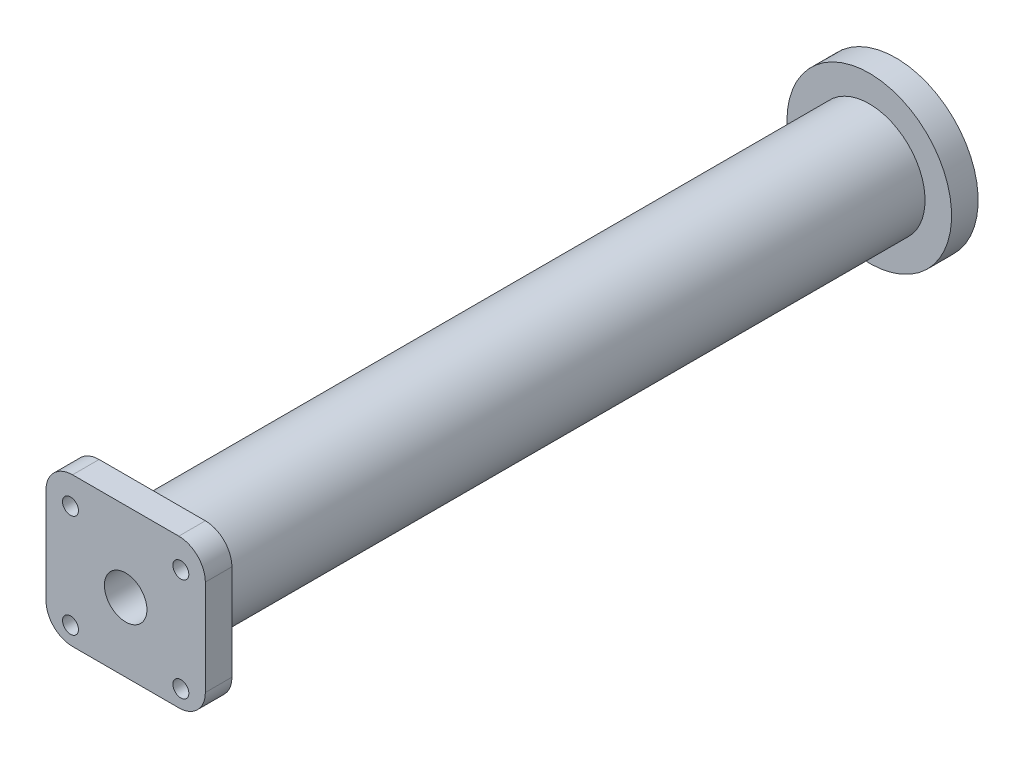
ISO-10303-21;
HEADER;
FILE_DESCRIPTION(('STEP AP214'),'2;1');
FILE_NAME('part.step','',(''),(''),'','','');
FILE_SCHEMA(('AUTOMOTIVE_DESIGN { 1 0 10303 214 1 1 1 1 }'));
ENDSEC;
DATA;
#1=APPLICATION_CONTEXT('core data for automotive mechanical design processes');
#2=APPLICATION_PROTOCOL_DEFINITION('international standard','automotive_design',2000,#1);
#3=PRODUCT_CONTEXT('',#1,'mechanical');
#4=PRODUCT('Part','Part','',(#3));
#5=PRODUCT_RELATED_PRODUCT_CATEGORY('part','',(#4));
#6=PRODUCT_DEFINITION_FORMATION('','',#4);
#7=PRODUCT_DEFINITION_CONTEXT('part definition',#1,'design');
#8=PRODUCT_DEFINITION('design','',#6,#7);
#9=PRODUCT_DEFINITION_SHAPE('','',#8);
#10=(LENGTH_UNIT() NAMED_UNIT(*) SI_UNIT(.MILLI.,.METRE.));
#11=(NAMED_UNIT(*) PLANE_ANGLE_UNIT() SI_UNIT($,.RADIAN.));
#12=(NAMED_UNIT(*) SI_UNIT($,.STERADIAN.) SOLID_ANGLE_UNIT());
#13=UNCERTAINTY_MEASURE_WITH_UNIT(LENGTH_MEASURE(1.E-05),#10,'distance_accuracy_value','');
#14=(GEOMETRIC_REPRESENTATION_CONTEXT(3) GLOBAL_UNCERTAINTY_ASSIGNED_CONTEXT((#13)) GLOBAL_UNIT_ASSIGNED_CONTEXT((#10,
#11,#12)) REPRESENTATION_CONTEXT('',''));
#15=CARTESIAN_POINT('',(0.,0.,0.));
#16=DIRECTION('',(0.,0.,1.));
#17=DIRECTION('',(1.,0.,0.));
#18=AXIS2_PLACEMENT_3D('',#15,#16,#17);
#19=CARTESIAN_POINT('',(0.,0.,140.));
#20=DIRECTION('',(0.,0.,-1.));
#21=DIRECTION('',(-1.,0.,0.));
#22=AXIS2_PLACEMENT_3D('',#19,#20,#21);
#23=CYLINDRICAL_SURFACE('',#22,10.5);
#24=CARTESIAN_POINT('',(0.,0.,140.));
#25=DIRECTION('',(0.,0.,1.));
#26=DIRECTION('',(1.,0.,0.));
#27=AXIS2_PLACEMENT_3D('',#24,#25,#26);
#28=CIRCLE('',#27,10.5);
#29=CARTESIAN_POINT('',(10.5,0.,140.));
#30=VERTEX_POINT('',#29);
#31=EDGE_CURVE('E158',#30,#30,#28,.T.);
#32=ORIENTED_EDGE('',*,*,#31,.F.);
#33=EDGE_LOOP('',(#32));
#34=FACE_BOUND('',#33,.T.);
#35=CARTESIAN_POINT('',(0.,0.,5.));
#36=DIRECTION('',(0.,0.,-1.));
#37=DIRECTION('',(-1.,0.,0.));
#38=AXIS2_PLACEMENT_3D('',#35,#36,#37);
#39=CIRCLE('',#38,10.5);
#40=CARTESIAN_POINT('',(-10.5,0.,5.));
#41=VERTEX_POINT('',#40);
#42=EDGE_CURVE('E12',#41,#41,#39,.T.);
#43=ORIENTED_EDGE('',*,*,#42,.F.);
#44=EDGE_LOOP('',(#43));
#45=FACE_BOUND('',#44,.T.);
#46=ADVANCED_FACE('F44',(#34,#45),#23,.T.);
#47=CARTESIAN_POINT('',(0.,0.,0.));
#48=DIRECTION('',(0.,0.,1.));
#49=DIRECTION('',(1.,0.,0.));
#50=AXIS2_PLACEMENT_3D('',#47,#48,#49);
#51=PLANE('',#50);
#52=CARTESIAN_POINT('',(0.,0.,0.));
#53=DIRECTION('',(0.,0.,1.));
#54=DIRECTION('',(1.,0.,0.));
#55=AXIS2_PLACEMENT_3D('',#52,#53,#54);
#56=CIRCLE('',#55,4.);
#57=CARTESIAN_POINT('',(4.,0.,0.));
#58=VERTEX_POINT('',#57);
#59=EDGE_CURVE('E155',#58,#58,#56,.T.);
#60=ORIENTED_EDGE('',*,*,#59,.T.);
#61=EDGE_LOOP('',(#60));
#62=FACE_BOUND('',#61,.T.);
#63=CARTESIAN_POINT('',(0.,0.,0.));
#64=DIRECTION('',(0.,0.,-1.));
#65=DIRECTION('',(-1.,0.,0.));
#66=AXIS2_PLACEMENT_3D('',#63,#64,#65);
#67=CIRCLE('',#66,15.5);
#68=CARTESIAN_POINT('',(-15.5,0.,0.));
#69=VERTEX_POINT('',#68);
#70=EDGE_CURVE('E223',#69,#69,#67,.T.);
#71=ORIENTED_EDGE('',*,*,#70,.T.);
#72=EDGE_LOOP('',(#71));
#73=FACE_BOUND('',#72,.T.);
#74=ADVANCED_FACE('F241',(#62,#73),#51,.F.);
#75=CARTESIAN_POINT('',(0.,0.,140.));
#76=DIRECTION('',(0.,0.,-1.));
#77=DIRECTION('',(-1.,0.,0.));
#78=AXIS2_PLACEMENT_3D('',#75,#76,#77);
#79=CYLINDRICAL_SURFACE('',#78,4.);
#80=ORIENTED_EDGE('',*,*,#59,.F.);
#81=EDGE_LOOP('',(#80));
#82=FACE_BOUND('',#81,.T.);
#83=CARTESIAN_POINT('',(0.,0.,145.));
#84=DIRECTION('',(0.,0.,1.));
#85=DIRECTION('',(1.,0.,0.));
#86=AXIS2_PLACEMENT_3D('',#83,#84,#85);
#87=CIRCLE('',#86,4.);
#88=CARTESIAN_POINT('',(4.,0.,145.));
#89=VERTEX_POINT('',#88);
#90=EDGE_CURVE('E217',#89,#89,#87,.T.);
#91=ORIENTED_EDGE('',*,*,#90,.T.);
#92=EDGE_LOOP('',(#91));
#93=FACE_BOUND('',#92,.T.);
#94=ADVANCED_FACE('F247',(#82,#93),#79,.F.);
#95=CARTESIAN_POINT('',(0.,0.,145.));
#96=DIRECTION('',(0.,0.,1.));
#97=DIRECTION('',(1.,0.,0.));
#98=AXIS2_PLACEMENT_3D('',#95,#96,#97);
#99=PLANE('',#98);
#100=CARTESIAN_POINT('',(-10.3882953617312,-9.69574233761576,145.));
#101=DIRECTION('',(0.,0.,1.));
#102=DIRECTION('',(1.,0.,0.));
#103=AXIS2_PLACEMENT_3D('',#100,#101,#102);
#104=CIRCLE('',#103,1.5);
#105=CARTESIAN_POINT('',(-8.88829536173118,-9.69574233761576,145.));
#106=VERTEX_POINT('',#105);
#107=EDGE_CURVE('E211',#106,#106,#104,.T.);
#108=ORIENTED_EDGE('',*,*,#107,.F.);
#109=EDGE_LOOP('',(#108));
#110=FACE_BOUND('',#109,.T.);
#111=CARTESIAN_POINT('',(10.3882953617312,-9.69574233761576,145.));
#112=DIRECTION('',(0.,0.,1.));
#113=DIRECTION('',(1.,0.,0.));
#114=AXIS2_PLACEMENT_3D('',#111,#112,#113);
#115=CIRCLE('',#114,1.5);
#116=CARTESIAN_POINT('',(11.8882953617312,-9.69574233761576,145.));
#117=VERTEX_POINT('',#116);
#118=EDGE_CURVE('E200',#117,#117,#115,.T.);
#119=ORIENTED_EDGE('',*,*,#118,.F.);
#120=EDGE_LOOP('',(#119));
#121=FACE_BOUND('',#120,.T.);
#122=DIRECTION('',(1.,0.,0.));
#123=VECTOR('',#122,1.);
#124=CARTESIAN_POINT('',(-15.,-13.,145.));
#125=LINE('',#124,#123);
#126=CARTESIAN_POINT('',(-10.,-13.,145.));
#127=VERTEX_POINT('',#126);
#128=CARTESIAN_POINT('',(10.,-13.,145.));
#129=VERTEX_POINT('',#128);
#130=EDGE_CURVE('E149',#127,#129,#125,.T.);
#131=ORIENTED_EDGE('',*,*,#130,.T.);
#132=CARTESIAN_POINT('',(10.,-8.,145.));
#133=DIRECTION('',(0.,0.,1.));
#134=DIRECTION('',(1.,0.,0.));
#135=AXIS2_PLACEMENT_3D('',#132,#133,#134);
#136=CIRCLE('',#135,5.);
#137=CARTESIAN_POINT('',(15.,-8.,145.));
#138=VERTEX_POINT('',#137);
#139=EDGE_CURVE('E173',#129,#138,#136,.T.);
#140=ORIENTED_EDGE('',*,*,#139,.T.);
#141=DIRECTION('',(0.,1.,0.));
#142=VECTOR('',#141,1.);
#143=CARTESIAN_POINT('',(15.,15.,145.));
#144=LINE('',#143,#142);
#145=CARTESIAN_POINT('',(15.,10.,145.));
#146=VERTEX_POINT('',#145);
#147=EDGE_CURVE('E131',#138,#146,#144,.T.);
#148=ORIENTED_EDGE('',*,*,#147,.T.);
#149=CARTESIAN_POINT('',(10.,10.,145.));
#150=DIRECTION('',(0.,0.,1.));
#151=DIRECTION('',(1.,0.,0.));
#152=AXIS2_PLACEMENT_3D('',#149,#150,#151);
#153=CIRCLE('',#152,5.);
#154=CARTESIAN_POINT('',(10.,15.,145.));
#155=VERTEX_POINT('',#154);
#156=EDGE_CURVE('E169',#146,#155,#153,.T.);
#157=ORIENTED_EDGE('',*,*,#156,.T.);
#158=DIRECTION('',(-1.,0.,0.));
#159=VECTOR('',#158,1.);
#160=CARTESIAN_POINT('',(-15.,15.,145.));
#161=LINE('',#160,#159);
#162=CARTESIAN_POINT('',(-10.,15.,145.));
#163=VERTEX_POINT('',#162);
#164=EDGE_CURVE('E186',#155,#163,#161,.T.);
#165=ORIENTED_EDGE('',*,*,#164,.T.);
#166=CARTESIAN_POINT('',(-10.,10.,145.));
#167=DIRECTION('',(0.,0.,1.));
#168=DIRECTION('',(1.,0.,0.));
#169=AXIS2_PLACEMENT_3D('',#166,#167,#168);
#170=CIRCLE('',#169,5.);
#171=CARTESIAN_POINT('',(-15.,10.,145.));
#172=VERTEX_POINT('',#171);
#173=EDGE_CURVE('E66',#163,#172,#170,.T.);
#174=ORIENTED_EDGE('',*,*,#173,.T.);
#175=DIRECTION('',(0.,-1.,0.));
#176=VECTOR('',#175,1.);
#177=CARTESIAN_POINT('',(-15.,15.,145.));
#178=LINE('',#177,#176);
#179=CARTESIAN_POINT('',(-15.,-8.,145.));
#180=VERTEX_POINT('',#179);
#181=EDGE_CURVE('E193',#172,#180,#178,.T.);
#182=ORIENTED_EDGE('',*,*,#181,.T.);
#183=CARTESIAN_POINT('',(-10.,-8.,145.));
#184=DIRECTION('',(0.,0.,1.));
#185=DIRECTION('',(1.,0.,0.));
#186=AXIS2_PLACEMENT_3D('',#183,#184,#185);
#187=CIRCLE('',#186,5.);
#188=EDGE_CURVE('E171',#180,#127,#187,.T.);
#189=ORIENTED_EDGE('',*,*,#188,.T.);
#190=EDGE_LOOP('',(#131,#140,#148,#157,#165,#174,#182,#189));
#191=FACE_BOUND('',#190,.T.);
#192=CARTESIAN_POINT('',(-10.3882953617312,9.69574233761576,145.));
#193=DIRECTION('',(0.,0.,1.));
#194=DIRECTION('',(1.,0.,0.));
#195=AXIS2_PLACEMENT_3D('',#192,#193,#194);
#196=CIRCLE('',#195,1.5);
#197=CARTESIAN_POINT('',(-8.88829536173118,9.69574233761576,145.));
#198=VERTEX_POINT('',#197);
#199=EDGE_CURVE('E140',#198,#198,#196,.T.);
#200=ORIENTED_EDGE('',*,*,#199,.F.);
#201=EDGE_LOOP('',(#200));
#202=FACE_BOUND('',#201,.T.);
#203=CARTESIAN_POINT('',(10.3882953617312,9.69574233761576,145.));
#204=DIRECTION('',(0.,0.,1.));
#205=DIRECTION('',(1.,0.,0.));
#206=AXIS2_PLACEMENT_3D('',#203,#204,#205);
#207=CIRCLE('',#206,1.5);
#208=CARTESIAN_POINT('',(11.8882953617312,9.69574233761576,145.));
#209=VERTEX_POINT('',#208);
#210=EDGE_CURVE('E205',#209,#209,#207,.T.);
#211=ORIENTED_EDGE('',*,*,#210,.F.);
#212=EDGE_LOOP('',(#211));
#213=FACE_BOUND('',#212,.T.);
#214=ORIENTED_EDGE('',*,*,#90,.F.);
#215=EDGE_LOOP('',(#214));
#216=FACE_BOUND('',#215,.T.);
#217=ADVANCED_FACE('F265',(#110,#121,#191,#202,#213,#216),#99,.T.);
#218=CARTESIAN_POINT('',(0.,0.,140.));
#219=DIRECTION('',(0.,0.,1.));
#220=DIRECTION('',(1.,0.,0.));
#221=AXIS2_PLACEMENT_3D('',#218,#219,#220);
#222=PLANE('',#221);
#223=ORIENTED_EDGE('',*,*,#31,.T.);
#224=EDGE_LOOP('',(#223));
#225=FACE_BOUND('',#224,.T.);
#226=DIRECTION('',(0.,1.,0.));
#227=VECTOR('',#226,1.);
#228=CARTESIAN_POINT('',(15.,15.,140.));
#229=LINE('',#228,#227);
#230=CARTESIAN_POINT('',(15.,-8.,140.));
#231=VERTEX_POINT('',#230);
#232=CARTESIAN_POINT('',(15.,10.,140.));
#233=VERTEX_POINT('',#232);
#234=EDGE_CURVE('E128',#231,#233,#229,.T.);
#235=ORIENTED_EDGE('',*,*,#234,.F.);
#236=CARTESIAN_POINT('',(10.,-8.,140.));
#237=DIRECTION('',(0.,0.,1.));
#238=DIRECTION('',(1.,0.,0.));
#239=AXIS2_PLACEMENT_3D('',#236,#237,#238);
#240=CIRCLE('',#239,5.);
#241=CARTESIAN_POINT('',(10.,-13.,140.));
#242=VERTEX_POINT('',#241);
#243=EDGE_CURVE('E111',#231,#242,#240,.F.);
#244=ORIENTED_EDGE('',*,*,#243,.T.);
#245=DIRECTION('',(1.,0.,0.));
#246=VECTOR('',#245,1.);
#247=CARTESIAN_POINT('',(-15.,-13.,140.));
#248=LINE('',#247,#246);
#249=CARTESIAN_POINT('',(-10.,-13.,140.));
#250=VERTEX_POINT('',#249);
#251=EDGE_CURVE('E153',#250,#242,#248,.T.);
#252=ORIENTED_EDGE('',*,*,#251,.F.);
#253=CARTESIAN_POINT('',(-10.,-8.,140.));
#254=DIRECTION('',(0.,0.,1.));
#255=DIRECTION('',(1.,0.,0.));
#256=AXIS2_PLACEMENT_3D('',#253,#254,#255);
#257=CIRCLE('',#256,5.);
#258=CARTESIAN_POINT('',(-15.,-8.,140.));
#259=VERTEX_POINT('',#258);
#260=EDGE_CURVE('E122',#250,#259,#257,.F.);
#261=ORIENTED_EDGE('',*,*,#260,.T.);
#262=DIRECTION('',(0.,-1.,0.));
#263=VECTOR('',#262,1.);
#264=CARTESIAN_POINT('',(-15.,15.,140.));
#265=LINE('',#264,#263);
#266=CARTESIAN_POINT('',(-15.,10.,140.));
#267=VERTEX_POINT('',#266);
#268=EDGE_CURVE('E143',#267,#259,#265,.T.);
#269=ORIENTED_EDGE('',*,*,#268,.F.);
#270=CARTESIAN_POINT('',(-10.,10.,140.));
#271=DIRECTION('',(0.,0.,1.));
#272=DIRECTION('',(1.,0.,0.));
#273=AXIS2_PLACEMENT_3D('',#270,#271,#272);
#274=CIRCLE('',#273,5.);
#275=CARTESIAN_POINT('',(-10.,15.,140.));
#276=VERTEX_POINT('',#275);
#277=EDGE_CURVE('E132',#267,#276,#274,.F.);
#278=ORIENTED_EDGE('',*,*,#277,.T.);
#279=DIRECTION('',(-1.,0.,0.));
#280=VECTOR('',#279,1.);
#281=CARTESIAN_POINT('',(-15.,15.,140.));
#282=LINE('',#281,#280);
#283=CARTESIAN_POINT('',(10.,15.,140.));
#284=VERTEX_POINT('',#283);
#285=EDGE_CURVE('E139',#284,#276,#282,.T.);
#286=ORIENTED_EDGE('',*,*,#285,.F.);
#287=CARTESIAN_POINT('',(10.,10.,140.));
#288=DIRECTION('',(0.,0.,1.));
#289=DIRECTION('',(1.,0.,0.));
#290=AXIS2_PLACEMENT_3D('',#287,#288,#289);
#291=CIRCLE('',#290,5.);
#292=EDGE_CURVE('E138',#284,#233,#291,.F.);
#293=ORIENTED_EDGE('',*,*,#292,.T.);
#294=EDGE_LOOP('',(#235,#244,#252,#261,#269,#278,#286,#293));
#295=FACE_BOUND('',#294,.T.);
#296=CARTESIAN_POINT('',(-10.3882953617312,9.69574233761576,140.));
#297=DIRECTION('',(0.,0.,1.));
#298=DIRECTION('',(1.,0.,0.));
#299=AXIS2_PLACEMENT_3D('',#296,#297,#298);
#300=CIRCLE('',#299,1.5);
#301=CARTESIAN_POINT('',(-8.88829536173118,9.69574233761576,140.));
#302=VERTEX_POINT('',#301);
#303=EDGE_CURVE('E146',#302,#302,#300,.T.);
#304=ORIENTED_EDGE('',*,*,#303,.T.);
#305=EDGE_LOOP('',(#304));
#306=FACE_BOUND('',#305,.T.);
#307=CARTESIAN_POINT('',(10.3882953617312,-9.69574233761576,140.));
#308=DIRECTION('',(0.,0.,1.));
#309=DIRECTION('',(1.,0.,0.));
#310=AXIS2_PLACEMENT_3D('',#307,#308,#309);
#311=CIRCLE('',#310,1.5);
#312=CARTESIAN_POINT('',(11.8882953617312,-9.69574233761576,140.));
#313=VERTEX_POINT('',#312);
#314=EDGE_CURVE('E202',#313,#313,#311,.T.);
#315=ORIENTED_EDGE('',*,*,#314,.T.);
#316=EDGE_LOOP('',(#315));
#317=FACE_BOUND('',#316,.T.);
#318=CARTESIAN_POINT('',(10.3882953617312,9.69574233761576,140.));
#319=DIRECTION('',(0.,0.,1.));
#320=DIRECTION('',(1.,0.,0.));
#321=AXIS2_PLACEMENT_3D('',#318,#319,#320);
#322=CIRCLE('',#321,1.5);
#323=CARTESIAN_POINT('',(11.8882953617312,9.69574233761576,140.));
#324=VERTEX_POINT('',#323);
#325=EDGE_CURVE('E208',#324,#324,#322,.T.);
#326=ORIENTED_EDGE('',*,*,#325,.T.);
#327=EDGE_LOOP('',(#326));
#328=FACE_BOUND('',#327,.T.);
#329=CARTESIAN_POINT('',(-10.3882953617312,-9.69574233761576,140.));
#330=DIRECTION('',(0.,0.,1.));
#331=DIRECTION('',(1.,0.,0.));
#332=AXIS2_PLACEMENT_3D('',#329,#330,#331);
#333=CIRCLE('',#332,1.5);
#334=CARTESIAN_POINT('',(-8.88829536173118,-9.69574233761576,140.));
#335=VERTEX_POINT('',#334);
#336=EDGE_CURVE('E214',#335,#335,#333,.T.);
#337=ORIENTED_EDGE('',*,*,#336,.T.);
#338=EDGE_LOOP('',(#337));
#339=FACE_BOUND('',#338,.T.);
#340=ADVANCED_FACE('F135',(#225,#295,#306,#317,#328,#339),#222,.F.);
#341=CARTESIAN_POINT('',(15.,15.,145.));
#342=DIRECTION('',(-1.,0.,0.));
#343=DIRECTION('',(0.,-1.,0.));
#344=AXIS2_PLACEMENT_3D('',#341,#342,#343);
#345=PLANE('',#344);
#346=ORIENTED_EDGE('',*,*,#147,.F.);
#347=DIRECTION('',(0.,0.,-1.));
#348=VECTOR('',#347,1.);
#349=CARTESIAN_POINT('',(15.,-8.,145.));
#350=LINE('',#349,#348);
#351=EDGE_CURVE('E115',#138,#231,#350,.T.);
#352=ORIENTED_EDGE('',*,*,#351,.T.);
#353=ORIENTED_EDGE('',*,*,#234,.T.);
#354=DIRECTION('',(0.,0.,-1.));
#355=VECTOR('',#354,1.);
#356=CARTESIAN_POINT('',(15.,10.,145.));
#357=LINE('',#356,#355);
#358=EDGE_CURVE('E133',#233,#146,#357,.F.);
#359=ORIENTED_EDGE('',*,*,#358,.T.);
#360=EDGE_LOOP('',(#346,#352,#353,#359));
#361=FACE_BOUND('',#360,.T.);
#362=ADVANCED_FACE('F127',(#361),#345,.F.);
#363=CARTESIAN_POINT('',(-15.,15.,145.));
#364=DIRECTION('',(0.,-1.,0.));
#365=DIRECTION('',(0.,0.,-1.));
#366=AXIS2_PLACEMENT_3D('',#363,#364,#365);
#367=PLANE('',#366);
#368=ORIENTED_EDGE('',*,*,#164,.F.);
#369=DIRECTION('',(0.,0.,-1.));
#370=VECTOR('',#369,1.);
#371=CARTESIAN_POINT('',(10.,15.,145.));
#372=LINE('',#371,#370);
#373=EDGE_CURVE('E52',#155,#284,#372,.T.);
#374=ORIENTED_EDGE('',*,*,#373,.T.);
#375=ORIENTED_EDGE('',*,*,#285,.T.);
#376=DIRECTION('',(0.,0.,-1.));
#377=VECTOR('',#376,1.);
#378=CARTESIAN_POINT('',(-10.,15.,145.));
#379=LINE('',#378,#377);
#380=EDGE_CURVE('E179',#276,#163,#379,.F.);
#381=ORIENTED_EDGE('',*,*,#380,.T.);
#382=EDGE_LOOP('',(#368,#374,#375,#381));
#383=FACE_BOUND('',#382,.T.);
#384=ADVANCED_FACE('F184',(#383),#367,.F.);
#385=CARTESIAN_POINT('',(-15.,15.,145.));
#386=DIRECTION('',(1.,0.,0.));
#387=DIRECTION('',(0.,1.,0.));
#388=AXIS2_PLACEMENT_3D('',#385,#386,#387);
#389=PLANE('',#388);
#390=ORIENTED_EDGE('',*,*,#268,.T.);
#391=DIRECTION('',(0.,0.,-1.));
#392=VECTOR('',#391,1.);
#393=CARTESIAN_POINT('',(-15.,-8.,145.));
#394=LINE('',#393,#392);
#395=EDGE_CURVE('E59',#259,#180,#394,.F.);
#396=ORIENTED_EDGE('',*,*,#395,.T.);
#397=ORIENTED_EDGE('',*,*,#181,.F.);
#398=DIRECTION('',(0.,0.,-1.));
#399=VECTOR('',#398,1.);
#400=CARTESIAN_POINT('',(-15.,10.,145.));
#401=LINE('',#400,#399);
#402=EDGE_CURVE('E175',#172,#267,#401,.T.);
#403=ORIENTED_EDGE('',*,*,#402,.T.);
#404=EDGE_LOOP('',(#390,#396,#397,#403));
#405=FACE_BOUND('',#404,.T.);
#406=ADVANCED_FACE('F192',(#405),#389,.F.);
#407=CARTESIAN_POINT('',(-15.,-13.,145.));
#408=DIRECTION('',(0.,1.,0.));
#409=DIRECTION('',(0.,0.,1.));
#410=AXIS2_PLACEMENT_3D('',#407,#408,#409);
#411=PLANE('',#410);
#412=ORIENTED_EDGE('',*,*,#251,.T.);
#413=DIRECTION('',(0.,0.,-1.));
#414=VECTOR('',#413,1.);
#415=CARTESIAN_POINT('',(10.,-13.,145.));
#416=LINE('',#415,#414);
#417=EDGE_CURVE('E116',#242,#129,#416,.F.);
#418=ORIENTED_EDGE('',*,*,#417,.T.);
#419=ORIENTED_EDGE('',*,*,#130,.F.);
#420=DIRECTION('',(0.,0.,-1.));
#421=VECTOR('',#420,1.);
#422=CARTESIAN_POINT('',(-10.,-13.,145.));
#423=LINE('',#422,#421);
#424=EDGE_CURVE('E121',#127,#250,#423,.T.);
#425=ORIENTED_EDGE('',*,*,#424,.T.);
#426=EDGE_LOOP('',(#412,#418,#419,#425));
#427=FACE_BOUND('',#426,.T.);
#428=ADVANCED_FACE('F270',(#427),#411,.F.);
#429=CARTESIAN_POINT('',(-10.3882953617312,9.69574233761576,145.));
#430=DIRECTION('',(0.,0.,-1.));
#431=DIRECTION('',(-1.,0.,0.));
#432=AXIS2_PLACEMENT_3D('',#429,#430,#431);
#433=CYLINDRICAL_SURFACE('',#432,1.5);
#434=ORIENTED_EDGE('',*,*,#199,.T.);
#435=EDGE_LOOP('',(#434));
#436=FACE_BOUND('',#435,.T.);
#437=ORIENTED_EDGE('',*,*,#303,.F.);
#438=EDGE_LOOP('',(#437));
#439=FACE_BOUND('',#438,.T.);
#440=ADVANCED_FACE('F272',(#436,#439),#433,.F.);
#441=CARTESIAN_POINT('',(10.3882953617312,-9.69574233761576,145.));
#442=DIRECTION('',(0.,0.,-1.));
#443=DIRECTION('',(-1.,0.,0.));
#444=AXIS2_PLACEMENT_3D('',#441,#442,#443);
#445=CYLINDRICAL_SURFACE('',#444,1.5);
#446=ORIENTED_EDGE('',*,*,#118,.T.);
#447=EDGE_LOOP('',(#446));
#448=FACE_BOUND('',#447,.T.);
#449=ORIENTED_EDGE('',*,*,#314,.F.);
#450=EDGE_LOOP('',(#449));
#451=FACE_BOUND('',#450,.T.);
#452=ADVANCED_FACE('F278',(#448,#451),#445,.F.);
#453=CARTESIAN_POINT('',(10.3882953617312,9.69574233761576,145.));
#454=DIRECTION('',(0.,0.,-1.));
#455=DIRECTION('',(-1.,0.,0.));
#456=AXIS2_PLACEMENT_3D('',#453,#454,#455);
#457=CYLINDRICAL_SURFACE('',#456,1.5);
#458=ORIENTED_EDGE('',*,*,#210,.T.);
#459=EDGE_LOOP('',(#458));
#460=FACE_BOUND('',#459,.T.);
#461=ORIENTED_EDGE('',*,*,#325,.F.);
#462=EDGE_LOOP('',(#461));
#463=FACE_BOUND('',#462,.T.);
#464=ADVANCED_FACE('F309',(#460,#463),#457,.F.);
#465=CARTESIAN_POINT('',(-10.3882953617312,-9.69574233761576,145.));
#466=DIRECTION('',(0.,0.,-1.));
#467=DIRECTION('',(-1.,0.,0.));
#468=AXIS2_PLACEMENT_3D('',#465,#466,#467);
#469=CYLINDRICAL_SURFACE('',#468,1.5);
#470=ORIENTED_EDGE('',*,*,#107,.T.);
#471=EDGE_LOOP('',(#470));
#472=FACE_BOUND('',#471,.T.);
#473=ORIENTED_EDGE('',*,*,#336,.F.);
#474=EDGE_LOOP('',(#473));
#475=FACE_BOUND('',#474,.T.);
#476=ADVANCED_FACE('F257',(#472,#475),#469,.F.);
#477=CARTESIAN_POINT('',(10.,-8.,145.));
#478=DIRECTION('',(0.,0.,-1.));
#479=DIRECTION('',(-1.,0.,0.));
#480=AXIS2_PLACEMENT_3D('',#477,#478,#479);
#481=CYLINDRICAL_SURFACE('',#480,5.);
#482=ORIENTED_EDGE('',*,*,#139,.F.);
#483=ORIENTED_EDGE('',*,*,#417,.F.);
#484=ORIENTED_EDGE('',*,*,#243,.F.);
#485=ORIENTED_EDGE('',*,*,#351,.F.);
#486=EDGE_LOOP('',(#482,#483,#484,#485));
#487=FACE_BOUND('',#486,.T.);
#488=ADVANCED_FACE('F114',(#487),#481,.T.);
#489=CARTESIAN_POINT('',(-10.,-8.,145.));
#490=DIRECTION('',(0.,0.,-1.));
#491=DIRECTION('',(-1.,0.,0.));
#492=AXIS2_PLACEMENT_3D('',#489,#490,#491);
#493=CYLINDRICAL_SURFACE('',#492,5.);
#494=ORIENTED_EDGE('',*,*,#188,.F.);
#495=ORIENTED_EDGE('',*,*,#395,.F.);
#496=ORIENTED_EDGE('',*,*,#260,.F.);
#497=ORIENTED_EDGE('',*,*,#424,.F.);
#498=EDGE_LOOP('',(#494,#495,#496,#497));
#499=FACE_BOUND('',#498,.T.);
#500=ADVANCED_FACE('F256',(#499),#493,.T.);
#501=CARTESIAN_POINT('',(10.,10.,145.));
#502=DIRECTION('',(0.,0.,-1.));
#503=DIRECTION('',(-1.,0.,0.));
#504=AXIS2_PLACEMENT_3D('',#501,#502,#503);
#505=CYLINDRICAL_SURFACE('',#504,5.);
#506=ORIENTED_EDGE('',*,*,#156,.F.);
#507=ORIENTED_EDGE('',*,*,#358,.F.);
#508=ORIENTED_EDGE('',*,*,#292,.F.);
#509=ORIENTED_EDGE('',*,*,#373,.F.);
#510=EDGE_LOOP('',(#506,#507,#508,#509));
#511=FACE_BOUND('',#510,.T.);
#512=ADVANCED_FACE('F259',(#511),#505,.T.);
#513=CARTESIAN_POINT('',(-10.,10.,145.));
#514=DIRECTION('',(0.,0.,-1.));
#515=DIRECTION('',(-1.,0.,0.));
#516=AXIS2_PLACEMENT_3D('',#513,#514,#515);
#517=CYLINDRICAL_SURFACE('',#516,5.);
#518=ORIENTED_EDGE('',*,*,#173,.F.);
#519=ORIENTED_EDGE('',*,*,#380,.F.);
#520=ORIENTED_EDGE('',*,*,#277,.F.);
#521=ORIENTED_EDGE('',*,*,#402,.F.);
#522=EDGE_LOOP('',(#518,#519,#520,#521));
#523=FACE_BOUND('',#522,.T.);
#524=ADVANCED_FACE('F46',(#523),#517,.T.);
#525=CARTESIAN_POINT('',(0.,0.,5.));
#526=DIRECTION('',(0.,0.,-1.));
#527=DIRECTION('',(-1.,0.,0.));
#528=AXIS2_PLACEMENT_3D('',#525,#526,#527);
#529=CYLINDRICAL_SURFACE('',#528,15.5);
#530=CARTESIAN_POINT('',(0.,0.,5.));
#531=DIRECTION('',(0.,0.,-1.));
#532=DIRECTION('',(-1.,0.,0.));
#533=AXIS2_PLACEMENT_3D('',#530,#531,#532);
#534=CIRCLE('',#533,15.5);
#535=CARTESIAN_POINT('',(-15.5,0.,5.));
#536=VERTEX_POINT('',#535);
#537=EDGE_CURVE('E222',#536,#536,#534,.T.);
#538=ORIENTED_EDGE('',*,*,#537,.T.);
#539=EDGE_LOOP('',(#538));
#540=FACE_BOUND('',#539,.T.);
#541=ORIENTED_EDGE('',*,*,#70,.F.);
#542=EDGE_LOOP('',(#541));
#543=FACE_BOUND('',#542,.T.);
#544=ADVANCED_FACE('F229',(#540,#543),#529,.T.);
#545=CARTESIAN_POINT('',(0.,0.,5.));
#546=DIRECTION('',(0.,0.,-1.));
#547=DIRECTION('',(-1.,0.,0.));
#548=AXIS2_PLACEMENT_3D('',#545,#546,#547);
#549=PLANE('',#548);
#550=ORIENTED_EDGE('',*,*,#42,.T.);
#551=EDGE_LOOP('',(#550));
#552=FACE_BOUND('',#551,.T.);
#553=ORIENTED_EDGE('',*,*,#537,.F.);
#554=EDGE_LOOP('',(#553));
#555=FACE_BOUND('',#554,.T.);
#556=ADVANCED_FACE('F232',(#552,#555),#549,.F.);
#557=CLOSED_SHELL('',(#46,#74,#94,#217,#340,#362,#384,#406,#428,#440,#452,#464,#476,#488,#500,
#512,#524,#544,#556));
#558=MANIFOLD_SOLID_BREP('B2',#557);
#559=ADVANCED_BREP_SHAPE_REPRESENTATION('',(#18,#558),#14);
#560=SHAPE_DEFINITION_REPRESENTATION(#9,#559);
ENDSEC;
END-ISO-10303-21;
